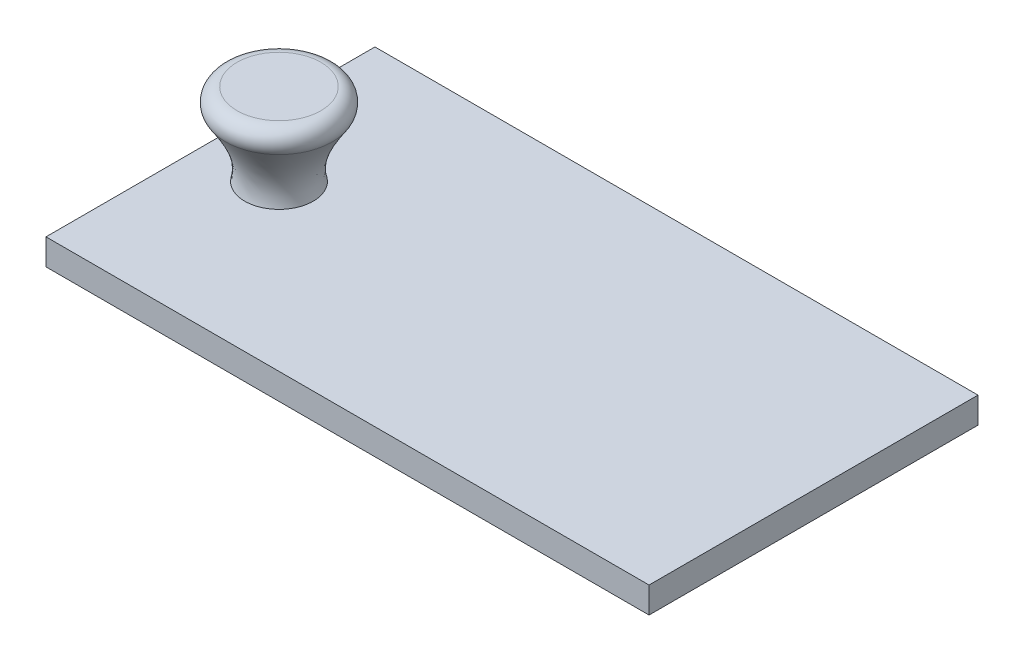
ISO-10303-21;
HEADER;
FILE_DESCRIPTION(('STEP AP214'),'2;1');
FILE_NAME('part.step','',(''),(''),'','','');
FILE_SCHEMA(('AUTOMOTIVE_DESIGN { 1 0 10303 214 1 1 1 1 }'));
ENDSEC;
DATA;
#1=APPLICATION_CONTEXT('core data for automotive mechanical design processes');
#2=APPLICATION_PROTOCOL_DEFINITION('international standard','automotive_design',2000,#1);
#3=PRODUCT_CONTEXT('',#1,'mechanical');
#4=PRODUCT('Part','Part','',(#3));
#5=PRODUCT_RELATED_PRODUCT_CATEGORY('part','',(#4));
#6=PRODUCT_DEFINITION_FORMATION('','',#4);
#7=PRODUCT_DEFINITION_CONTEXT('part definition',#1,'design');
#8=PRODUCT_DEFINITION('design','',#6,#7);
#9=PRODUCT_DEFINITION_SHAPE('','',#8);
#10=(LENGTH_UNIT() NAMED_UNIT(*) SI_UNIT(.MILLI.,.METRE.));
#11=(NAMED_UNIT(*) PLANE_ANGLE_UNIT() SI_UNIT($,.RADIAN.));
#12=(NAMED_UNIT(*) SI_UNIT($,.STERADIAN.) SOLID_ANGLE_UNIT());
#13=UNCERTAINTY_MEASURE_WITH_UNIT(LENGTH_MEASURE(1.E-05),#10,'distance_accuracy_value','');
#14=(GEOMETRIC_REPRESENTATION_CONTEXT(3) GLOBAL_UNCERTAINTY_ASSIGNED_CONTEXT((#13)) GLOBAL_UNIT_ASSIGNED_CONTEXT((#10,
#11,#12)) REPRESENTATION_CONTEXT('',''));
#15=CARTESIAN_POINT('',(0.,0.,0.));
#16=DIRECTION('',(0.,0.,1.));
#17=DIRECTION('',(1.,0.,0.));
#18=AXIS2_PLACEMENT_3D('',#15,#16,#17);
#19=CARTESIAN_POINT('',(22.,1.9,12.));
#20=DIRECTION('',(-1.,0.,0.));
#21=DIRECTION('',(0.,0.,1.));
#22=AXIS2_PLACEMENT_3D('',#19,#20,#21);
#23=PLANE('',#22);
#24=DIRECTION('',(0.,0.,-1.));
#25=VECTOR('',#24,1.);
#26=CARTESIAN_POINT('',(22.,0.,12.));
#27=LINE('',#26,#25);
#28=CARTESIAN_POINT('',(22.,0.,12.));
#29=VERTEX_POINT('',#28);
#30=CARTESIAN_POINT('',(22.,0.,-12.));
#31=VERTEX_POINT('',#30);
#32=EDGE_CURVE('E103',#29,#31,#27,.T.);
#33=ORIENTED_EDGE('',*,*,#32,.T.);
#34=DIRECTION('',(0.,-1.,0.));
#35=VECTOR('',#34,1.);
#36=CARTESIAN_POINT('',(22.,1.9,-12.));
#37=LINE('',#36,#35);
#38=CARTESIAN_POINT('',(22.,1.9,-12.));
#39=VERTEX_POINT('',#38);
#40=EDGE_CURVE('E94',#39,#31,#37,.T.);
#41=ORIENTED_EDGE('',*,*,#40,.F.);
#42=DIRECTION('',(0.,0.,-1.));
#43=VECTOR('',#42,1.);
#44=CARTESIAN_POINT('',(22.,1.9,12.));
#45=LINE('',#44,#43);
#46=CARTESIAN_POINT('',(22.,1.9,12.));
#47=VERTEX_POINT('',#46);
#48=EDGE_CURVE('E88',#47,#39,#45,.T.);
#49=ORIENTED_EDGE('',*,*,#48,.F.);
#50=DIRECTION('',(0.,-1.,0.));
#51=VECTOR('',#50,1.);
#52=CARTESIAN_POINT('',(22.,1.9,12.));
#53=LINE('',#52,#51);
#54=EDGE_CURVE('E99',#47,#29,#53,.T.);
#55=ORIENTED_EDGE('',*,*,#54,.T.);
#56=EDGE_LOOP('',(#33,#41,#49,#55));
#57=FACE_BOUND('',#56,.T.);
#58=ADVANCED_FACE('F35',(#57),#23,.F.);
#59=CARTESIAN_POINT('',(-22.,1.9,-12.));
#60=DIRECTION('',(0.,0.,1.));
#61=DIRECTION('',(1.,0.,0.));
#62=AXIS2_PLACEMENT_3D('',#59,#60,#61);
#63=PLANE('',#62);
#64=DIRECTION('',(-1.,0.,0.));
#65=VECTOR('',#64,1.);
#66=CARTESIAN_POINT('',(-22.,0.,-12.));
#67=LINE('',#66,#65);
#68=CARTESIAN_POINT('',(-22.,0.,-12.));
#69=VERTEX_POINT('',#68);
#70=EDGE_CURVE('E93',#31,#69,#67,.T.);
#71=ORIENTED_EDGE('',*,*,#70,.T.);
#72=DIRECTION('',(0.,-1.,0.));
#73=VECTOR('',#72,1.);
#74=CARTESIAN_POINT('',(-22.,1.9,-12.));
#75=LINE('',#74,#73);
#76=CARTESIAN_POINT('',(-22.,1.9,-12.));
#77=VERTEX_POINT('',#76);
#78=EDGE_CURVE('E91',#77,#69,#75,.T.);
#79=ORIENTED_EDGE('',*,*,#78,.F.);
#80=DIRECTION('',(-1.,0.,0.));
#81=VECTOR('',#80,1.);
#82=CARTESIAN_POINT('',(-22.,1.9,-12.));
#83=LINE('',#82,#81);
#84=EDGE_CURVE('E83',#39,#77,#83,.T.);
#85=ORIENTED_EDGE('',*,*,#84,.F.);
#86=ORIENTED_EDGE('',*,*,#40,.T.);
#87=EDGE_LOOP('',(#71,#79,#85,#86));
#88=FACE_BOUND('',#87,.T.);
#89=ADVANCED_FACE('F92',(#88),#63,.F.);
#90=CARTESIAN_POINT('',(-22.,1.9,12.));
#91=DIRECTION('',(1.,0.,0.));
#92=DIRECTION('',(0.,0.,-1.));
#93=AXIS2_PLACEMENT_3D('',#90,#91,#92);
#94=PLANE('',#93);
#95=DIRECTION('',(0.,0.,1.));
#96=VECTOR('',#95,1.);
#97=CARTESIAN_POINT('',(-22.,0.,12.));
#98=LINE('',#97,#96);
#99=CARTESIAN_POINT('',(-22.,0.,12.));
#100=VERTEX_POINT('',#99);
#101=EDGE_CURVE('E69',#69,#100,#98,.T.);
#102=ORIENTED_EDGE('',*,*,#101,.T.);
#103=DIRECTION('',(0.,-1.,0.));
#104=VECTOR('',#103,1.);
#105=CARTESIAN_POINT('',(-22.,1.9,12.));
#106=LINE('',#105,#104);
#107=CARTESIAN_POINT('',(-22.,1.9,12.));
#108=VERTEX_POINT('',#107);
#109=EDGE_CURVE('E95',#108,#100,#106,.T.);
#110=ORIENTED_EDGE('',*,*,#109,.F.);
#111=DIRECTION('',(0.,0.,1.));
#112=VECTOR('',#111,1.);
#113=CARTESIAN_POINT('',(-22.,1.9,12.));
#114=LINE('',#113,#112);
#115=EDGE_CURVE('E86',#77,#108,#114,.T.);
#116=ORIENTED_EDGE('',*,*,#115,.F.);
#117=ORIENTED_EDGE('',*,*,#78,.T.);
#118=EDGE_LOOP('',(#102,#110,#116,#117));
#119=FACE_BOUND('',#118,.T.);
#120=ADVANCED_FACE('F97',(#119),#94,.F.);
#121=CARTESIAN_POINT('',(-22.,1.9,12.));
#122=DIRECTION('',(0.,0.,-1.));
#123=DIRECTION('',(-1.,0.,0.));
#124=AXIS2_PLACEMENT_3D('',#121,#122,#123);
#125=PLANE('',#124);
#126=DIRECTION('',(1.,0.,0.));
#127=VECTOR('',#126,1.);
#128=CARTESIAN_POINT('',(-22.,0.,12.));
#129=LINE('',#128,#127);
#130=EDGE_CURVE('E75',#100,#29,#129,.T.);
#131=ORIENTED_EDGE('',*,*,#130,.T.);
#132=ORIENTED_EDGE('',*,*,#54,.F.);
#133=DIRECTION('',(1.,0.,0.));
#134=VECTOR('',#133,1.);
#135=CARTESIAN_POINT('',(-22.,1.9,12.));
#136=LINE('',#135,#134);
#137=EDGE_CURVE('E52',#108,#47,#136,.T.);
#138=ORIENTED_EDGE('',*,*,#137,.F.);
#139=ORIENTED_EDGE('',*,*,#109,.T.);
#140=EDGE_LOOP('',(#131,#132,#138,#139));
#141=FACE_BOUND('',#140,.T.);
#142=ADVANCED_FACE('F135',(#141),#125,.F.);
#143=CARTESIAN_POINT('',(0.,1.9,0.));
#144=DIRECTION('',(0.,-1.,0.));
#145=DIRECTION('',(0.,0.,-1.));
#146=AXIS2_PLACEMENT_3D('',#143,#144,#145);
#147=PLANE('',#146);
#148=CARTESIAN_POINT('',(-17.,1.9,0.));
#149=DIRECTION('',(0.,1.,0.));
#150=DIRECTION('',(0.,0.,1.));
#151=AXIS2_PLACEMENT_3D('',#148,#149,#150);
#152=CIRCLE('',#151,2.5);
#153=CARTESIAN_POINT('',(-14.7382792496135,1.9,-1.06518507653414));
#154=VERTEX_POINT('',#153);
#155=EDGE_CURVE('E106',#154,#154,#152,.T.);
#156=ORIENTED_EDGE('',*,*,#155,.F.);
#157=EDGE_LOOP('',(#156));
#158=FACE_BOUND('',#157,.T.);
#159=ORIENTED_EDGE('',*,*,#48,.T.);
#160=ORIENTED_EDGE('',*,*,#84,.T.);
#161=ORIENTED_EDGE('',*,*,#115,.T.);
#162=ORIENTED_EDGE('',*,*,#137,.T.);
#163=EDGE_LOOP('',(#159,#160,#161,#162));
#164=FACE_BOUND('',#163,.T.);
#165=ADVANCED_FACE('F84',(#158,#164),#147,.F.);
#166=CARTESIAN_POINT('',(0.,0.,0.));
#167=DIRECTION('',(0.,-1.,0.));
#168=DIRECTION('',(0.,0.,-1.));
#169=AXIS2_PLACEMENT_3D('',#166,#167,#168);
#170=PLANE('',#169);
#171=ORIENTED_EDGE('',*,*,#32,.F.);
#172=ORIENTED_EDGE('',*,*,#130,.F.);
#173=ORIENTED_EDGE('',*,*,#101,.F.);
#174=ORIENTED_EDGE('',*,*,#70,.F.);
#175=EDGE_LOOP('',(#171,#172,#173,#174));
#176=FACE_BOUND('',#175,.T.);
#177=ADVANCED_FACE('F138',(#176),#170,.T.);
#178=CARTESIAN_POINT('',(-17.,7.9,0.));
#179=DIRECTION('',(0.,1.,0.));
#180=DIRECTION('',(0.,0.,1.));
#181=AXIS2_PLACEMENT_3D('',#178,#179,#180);
#182=PLANE('',#181);
#183=CARTESIAN_POINT('',(-17.,7.9,0.));
#184=DIRECTION('',(0.,1.,0.));
#185=DIRECTION('',(0.,0.,1.));
#186=AXIS2_PLACEMENT_3D('',#183,#184,#185);
#187=CIRCLE('',#186,3.06017888052602);
#188=CARTESIAN_POINT('',(-17.,7.9,3.06017888052602));
#189=VERTEX_POINT('',#188);
#190=EDGE_CURVE('E44',#189,#189,#187,.T.);
#191=ORIENTED_EDGE('',*,*,#190,.T.);
#192=EDGE_LOOP('',(#191));
#193=FACE_BOUND('',#192,.T.);
#194=ADVANCED_FACE('F115',(#193),#182,.T.);
#195=CARTESIAN_POINT('',(-13.9678370903326,7.9,3.97567454518571));
#196=CARTESIAN_POINT('',(-14.7382792496135,1.9,-1.06518507653414));
#197=CARTESIAN_POINT('',(-21.919186180704,7.9,10.0400003645204));
#198=CARTESIAN_POINT('',(-12.6079090965452,1.9,3.4582564242389));
#199=CARTESIAN_POINT('',(-27.9835120000388,7.9,2.08865127414902));
#200=CARTESIAN_POINT('',(-17.1313505973182,1.9,5.58862657730718));
#201=CARTESIAN_POINT('',(-20.0321629096674,7.9,-3.97567454518571));
#202=CARTESIAN_POINT('',(-19.2617207503865,1.9,1.06518507653414));
#203=CARTESIAN_POINT('',(-12.080813819296,7.9,-10.0400003645204));
#204=CARTESIAN_POINT('',(-21.3920909034548,1.9,-3.4582564242389));
#205=CARTESIAN_POINT('',(-6.01648799996123,7.9,-2.08865127414902));
#206=CARTESIAN_POINT('',(-16.8686494026818,1.9,-5.58862657730718));
#207=CARTESIAN_POINT('',(-13.9678370903326,7.9,3.97567454518571));
#208=CARTESIAN_POINT('',(-14.7382792496135,1.9,-1.06518507653414));
#209=(BOUNDED_SURFACE() B_SPLINE_SURFACE(3,1,((#195,#196),(#197,#198),(#199,#200),(#201,#202),
(#203,#204),(#205,#206),(#207,#208)),.UNSPECIFIED.,.T.,.F.,.F.) B_SPLINE_SURFACE_WITH_KNOTS((4,
3,4),(2,2),(0.,0.5,1.),(0.,1.),
.UNSPECIFIED.) GEOMETRIC_REPRESENTATION_ITEM() RATIONAL_B_SPLINE_SURFACE(((1.,1.),
(0.333333333333333,0.333333333333333),(0.333333333333333,0.333333333333333),(1.,1.),
(0.333333333333333,0.333333333333333),(0.333333333333333,0.333333333333333),(1.,1.))) REPRESENTATION_ITEM('') SURFACE());
#210=CARTESIAN_POINT('',(-17.,6.34364445551614,0.));
#211=DIRECTION('',(0.,-1.,0.));
#212=DIRECTION('',(0.,0.,-1.));
#213=AXIS2_PLACEMENT_3D('',#210,#211,#212);
#214=CIRCLE('',#213,3.89112322771304);
#215=CARTESIAN_POINT('',(-14.1676840780495,6.34364445551614,2.66811290831429));
#216=VERTEX_POINT('',#215);
#217=EDGE_CURVE('E12',#216,#216,#214,.T.);
#218=CARTESIAN_POINT('',(-14.1676840780495,6.34364445551614,2.66811290831429));
#219=CARTESIAN_POINT('',(-14.1736277777532,6.29735649243785,2.62922438763879));
#220=CARTESIAN_POINT('',(-14.179571477457,6.25106852935956,2.59033586696328));
#221=CARTESIAN_POINT('',(-14.1914588768646,6.15849260320297,2.51255882561227));
#222=CARTESIAN_POINT('',(-14.1974025765684,6.11220464012468,2.47367030493677));
#223=CARTESIAN_POINT('',(-14.209289975976,6.01962871396809,2.39589326358576));
#224=CARTESIAN_POINT('',(-14.2152336756798,5.9733407508898,2.35700474291025));
#225=CARTESIAN_POINT('',(-14.2271210750874,5.88076482473321,2.27922770155925));
#226=CARTESIAN_POINT('',(-14.2330647747912,5.83447686165492,2.24033918088374));
#227=CARTESIAN_POINT('',(-14.2449521741987,5.74190093549833,2.16256213953273));
#228=CARTESIAN_POINT('',(-14.2508958739025,5.69561297242004,2.12367361885723));
#229=CARTESIAN_POINT('',(-14.2627832733101,5.60303704626345,2.04589657750622));
#230=CARTESIAN_POINT('',(-14.2687269730139,5.55674908318516,2.00700805683071));
#231=CARTESIAN_POINT('',(-14.2806143724215,5.46417315702857,1.92923101547971));
#232=CARTESIAN_POINT('',(-14.2865580721253,5.41788519395028,1.8903424948042));
#233=CARTESIAN_POINT('',(-14.2984454715329,5.32530926779369,1.81256545345319));
#234=CARTESIAN_POINT('',(-14.3043891712367,5.2790213047154,1.77367693277769));
#235=CARTESIAN_POINT('',(-14.3162765706443,5.18644537855881,1.69589989142668));
#236=CARTESIAN_POINT('',(-14.322220270348,5.14015741548052,1.65701137075117));
#237=CARTESIAN_POINT('',(-14.3341076697556,5.04758148932393,1.57923432940017));
#238=CARTESIAN_POINT('',(-14.3400513694594,5.00129352624564,1.54034580872466));
#239=CARTESIAN_POINT('',(-14.351938768867,4.90871760008905,1.46256876737365));
#240=CARTESIAN_POINT('',(-14.3578824685708,4.86242963701076,1.42368024669815));
#241=CARTESIAN_POINT('',(-14.3697698679784,4.76985371085417,1.34590320534714));
#242=CARTESIAN_POINT('',(-14.3757135676822,4.72356574777588,1.30701468467163));
#243=CARTESIAN_POINT('',(-14.3876009670898,4.63098982161929,1.22923764332063));
#244=CARTESIAN_POINT('',(-14.3935446667935,4.584701858541,1.19034912264512));
#245=CARTESIAN_POINT('',(-14.4054320662011,4.49212593238442,1.11257208129411));
#246=CARTESIAN_POINT('',(-14.4113757659049,4.44583796930612,1.07368356061861));
#247=CARTESIAN_POINT('',(-14.4232631653125,4.35326204314954,0.995906519267599));
#248=CARTESIAN_POINT('',(-14.4292068650163,4.30697408007124,0.957017998592094));
#249=CARTESIAN_POINT('',(-14.4410942644239,4.21439815391466,0.879240957241085));
#250=CARTESIAN_POINT('',(-14.4470379641277,4.16811019083636,0.840352436565581));
#251=CARTESIAN_POINT('',(-14.4589253635353,4.07553426467978,0.762575395214572));
#252=CARTESIAN_POINT('',(-14.4648690632391,4.02924630160149,0.723686874539067));
#253=CARTESIAN_POINT('',(-14.4767564626466,3.9366703754449,0.645909833188058));
#254=CARTESIAN_POINT('',(-14.4827001623504,3.8903824123666,0.607021312512554));
#255=CARTESIAN_POINT('',(-14.494587561758,3.79780648621002,0.529244271161545));
#256=CARTESIAN_POINT('',(-14.5005312614618,3.75151852313173,0.49035575048604));
#257=CARTESIAN_POINT('',(-14.5124186608694,3.65894259697514,0.412578709135031));
#258=CARTESIAN_POINT('',(-14.5183623605732,3.61265463389685,0.373690188459527));
#259=CARTESIAN_POINT('',(-14.5302497599808,3.52007870774026,0.295913147108518));
#260=CARTESIAN_POINT('',(-14.5361934596846,3.47379074466197,0.257024626433013));
#261=CARTESIAN_POINT('',(-14.5480808590921,3.38121481850538,0.179247585082005));
#262=CARTESIAN_POINT('',(-14.5540245587959,3.33492685542709,0.1403590644065));
#263=CARTESIAN_POINT('',(-14.5659119582035,3.2423509292705,0.0625820230554912));
#264=CARTESIAN_POINT('',(-14.5718556579073,3.19606296619221,0.0236935023799868));
#265=CARTESIAN_POINT('',(-14.5837430573149,3.10348704003562,-0.054083538971022));
#266=CARTESIAN_POINT('',(-14.5896867570187,3.05719907695733,-0.0929720596465265));
#267=CARTESIAN_POINT('',(-14.6015741564263,2.96462315080074,-0.170749100997535));
#268=CARTESIAN_POINT('',(-14.6075178561301,2.91833518772245,-0.20963762167304));
#269=CARTESIAN_POINT('',(-14.6194052555376,2.82575926156586,-0.287414663024049));
#270=CARTESIAN_POINT('',(-14.6253489552414,2.77947129848757,-0.326303183699553));
#271=CARTESIAN_POINT('',(-14.637236354649,2.68689537233098,-0.404080225050562));
#272=CARTESIAN_POINT('',(-14.6431800543528,2.64060740925269,-0.442968745726067));
#273=CARTESIAN_POINT('',(-14.6550674537604,2.5480314830961,-0.520745787077076));
#274=CARTESIAN_POINT('',(-14.6610111534642,2.50174352001781,-0.55963430775258));
#275=CARTESIAN_POINT('',(-14.6728985528718,2.40916759386122,-0.637411349103589));
#276=CARTESIAN_POINT('',(-14.6788422525756,2.36287963078293,-0.676299869779093));
#277=CARTESIAN_POINT('',(-14.6907296519831,2.27030370462635,-0.754076911130102));
#278=CARTESIAN_POINT('',(-14.6966733516869,2.22401574154805,-0.792965431805607));
#279=CARTESIAN_POINT('',(-14.7085607510945,2.13143981539147,-0.870742473156616));
#280=CARTESIAN_POINT('',(-14.7145044507983,2.08515185231317,-0.90963099383212));
#281=CARTESIAN_POINT('',(-14.7263918502059,1.99257592615659,-0.987408035183129));
#282=CARTESIAN_POINT('',(-14.7323355499097,1.94628796307829,-1.02629655585863));
#283=CARTESIAN_POINT('',(-14.7382792496135,1.9,-1.06518507653414));
#284=B_SPLINE_CURVE_WITH_KNOTS('',3,(#218,#219,#220,#221,#222,#223,#224,#225,#226,#227,#228,
#229,#230,#231,#232,#233,#234,#235,#236,#237,#238,#239,#240,#241,#242,#243,#244,#245,#246,#247,
#248,#249,#250,#251,#252,#253,#254,#255,#256,#257,#258,#259,#260,#261,#262,#263,#264,#265,#266,
#267,#268,#269,#270,#271,#272,#273,#274,#275,#276,#277,#278,#279,#280,#281,#282,#283),
.UNSPECIFIED.,.F.,.F.,(4,2,2,2,2,2,2,2,2,2,2,2,2,2,2,2,2,2,2,2,2,2,2,2,2,2,2,2,2,2,2,2,4),(0.,
0.182241546283822,0.364483092567646,0.546724638851469,0.728966185135292,0.911207731419115,
1.09344927770294,1.27569082398676,1.45793237027058,1.64017391655441,1.82241546283823,
2.00465700912205,2.18689855540588,2.3691401016897,2.55138164797352,2.73362319425734,
2.91586474054117,3.09810628682499,3.28034783310881,3.46258937939264,3.64483092567646,
3.82707247196028,4.00931401824411,4.19155556452793,4.37379711081175,4.55603865709557,
4.7382802033794,4.92052174966322,5.10276329594704,5.28500484223087,5.46724638851469,
5.64948793479851,5.83172948108234),.UNSPECIFIED.);
#285=EDGE_CURVE('BSEAM118',#216,#154,#284,.T.);
#286=ORIENTED_EDGE('',*,*,#217,.T.);
#287=ORIENTED_EDGE('',*,*,#155,.T.);
#288=ORIENTED_EDGE('',*,*,#285,.T.);
#289=ORIENTED_EDGE('',*,*,#285,.F.);
#290=EDGE_LOOP('',(#286,#288,#287,#289));
#291=FACE_BOUND('',#290,.T.);
#292=ADVANCED_FACE('F118',(#291),#209,.T.);
#293=CARTESIAN_POINT('',(-17.,6.9,0.));
#294=DIRECTION('',(0.,-1.,0.));
#295=DIRECTION('',(0.,0.,-1.));
#296=AXIS2_PLACEMENT_3D('',#293,#294,#295);
#297=TOROIDAL_SURFACE('',#296,3.06017888052602,1.);
#298=ORIENTED_EDGE('',*,*,#217,.F.);
#299=EDGE_LOOP('',(#298));
#300=FACE_BOUND('',#299,.T.);
#301=ORIENTED_EDGE('',*,*,#190,.F.);
#302=EDGE_LOOP('',(#301));
#303=FACE_BOUND('',#302,.T.);
#304=ADVANCED_FACE('F37',(#300,#303),#297,.T.);
#305=CLOSED_SHELL('',(#58,#89,#120,#142,#165,#177,#194,#292,#304));
#306=MANIFOLD_SOLID_BREP('B2',#305);
#307=ADVANCED_BREP_SHAPE_REPRESENTATION('',(#18,#306),#14);
#308=SHAPE_DEFINITION_REPRESENTATION(#9,#307);
ENDSEC;
END-ISO-10303-21;
